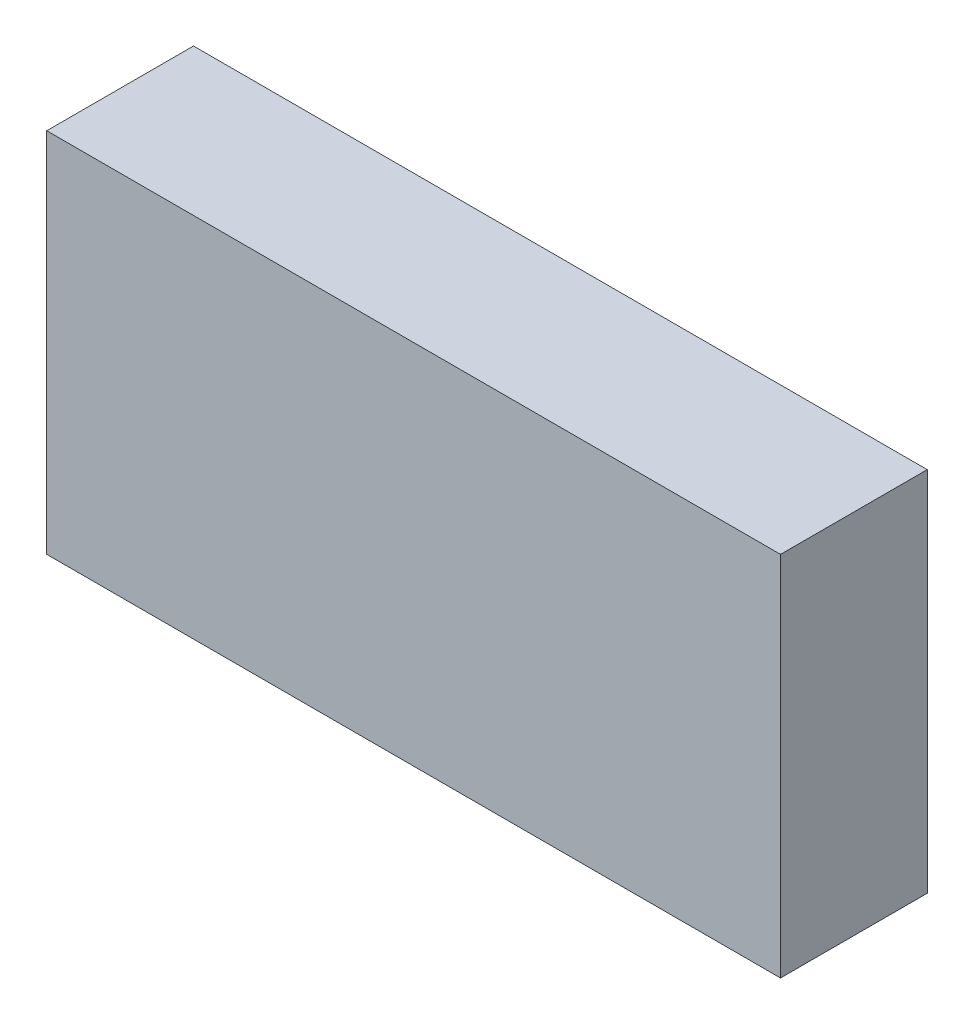
ISO-10303-21;
HEADER;
FILE_DESCRIPTION(('STEP AP214'),'2;1');
FILE_NAME('part.step','',(''),(''),'','','');
FILE_SCHEMA(('AUTOMOTIVE_DESIGN { 1 0 10303 214 1 1 1 1 }'));
ENDSEC;
DATA;
#1=APPLICATION_CONTEXT('core data for automotive mechanical design processes');
#2=APPLICATION_PROTOCOL_DEFINITION('international standard','automotive_design',2000,#1);
#3=PRODUCT_CONTEXT('',#1,'mechanical');
#4=PRODUCT('Part','Part','',(#3));
#5=PRODUCT_RELATED_PRODUCT_CATEGORY('part','',(#4));
#6=PRODUCT_DEFINITION_FORMATION('','',#4);
#7=PRODUCT_DEFINITION_CONTEXT('part definition',#1,'design');
#8=PRODUCT_DEFINITION('design','',#6,#7);
#9=PRODUCT_DEFINITION_SHAPE('','',#8);
#10=(LENGTH_UNIT() NAMED_UNIT(*) SI_UNIT(.MILLI.,.METRE.));
#11=(NAMED_UNIT(*) PLANE_ANGLE_UNIT() SI_UNIT($,.RADIAN.));
#12=(NAMED_UNIT(*) SI_UNIT($,.STERADIAN.) SOLID_ANGLE_UNIT());
#13=UNCERTAINTY_MEASURE_WITH_UNIT(LENGTH_MEASURE(1.E-05),#10,'distance_accuracy_value','');
#14=(GEOMETRIC_REPRESENTATION_CONTEXT(3) GLOBAL_UNCERTAINTY_ASSIGNED_CONTEXT((#13)) GLOBAL_UNIT_ASSIGNED_CONTEXT((#10,
#11,#12)) REPRESENTATION_CONTEXT('',''));
#15=CARTESIAN_POINT('',(0.,0.,0.));
#16=DIRECTION('',(0.,0.,1.));
#17=DIRECTION('',(1.,0.,0.));
#18=AXIS2_PLACEMENT_3D('',#15,#16,#17);
#19=CARTESIAN_POINT('',(3.,55.,20.));
#20=DIRECTION('',(1.,0.,0.));
#21=DIRECTION('',(0.,0.,-1.));
#22=AXIS2_PLACEMENT_3D('',#19,#20,#21);
#23=PLANE('',#22);
#24=DIRECTION('',(0.,-1.,0.));
#25=VECTOR('',#24,1.);
#26=CARTESIAN_POINT('',(3.,55.,0.));
#27=LINE('',#26,#25);
#28=CARTESIAN_POINT('',(3.,55.,0.));
#29=VERTEX_POINT('',#28);
#30=CARTESIAN_POINT('',(3.,5.,0.));
#31=VERTEX_POINT('',#30);
#32=EDGE_CURVE('E148',#29,#31,#27,.T.);
#33=ORIENTED_EDGE('',*,*,#32,.T.);
#34=DIRECTION('',(0.,0.,-1.));
#35=VECTOR('',#34,1.);
#36=CARTESIAN_POINT('',(3.,5.,20.));
#37=LINE('',#36,#35);
#38=CARTESIAN_POINT('',(3.,5.,20.));
#39=VERTEX_POINT('',#38);
#40=EDGE_CURVE('E139',#39,#31,#37,.T.);
#41=ORIENTED_EDGE('',*,*,#40,.F.);
#42=DIRECTION('',(0.,-1.,0.));
#43=VECTOR('',#42,1.);
#44=CARTESIAN_POINT('',(3.,55.,20.));
#45=LINE('',#44,#43);
#46=CARTESIAN_POINT('',(3.,55.,20.));
#47=VERTEX_POINT('',#46);
#48=EDGE_CURVE('E133',#47,#39,#45,.T.);
#49=ORIENTED_EDGE('',*,*,#48,.F.);
#50=DIRECTION('',(0.,0.,-1.));
#51=VECTOR('',#50,1.);
#52=CARTESIAN_POINT('',(3.,55.,20.));
#53=LINE('',#52,#51);
#54=EDGE_CURVE('E144',#47,#29,#53,.T.);
#55=ORIENTED_EDGE('',*,*,#54,.T.);
#56=EDGE_LOOP('',(#33,#41,#49,#55));
#57=FACE_BOUND('',#56,.T.);
#58=ADVANCED_FACE('F42',(#57),#23,.F.);
#59=CARTESIAN_POINT('',(3.,5.,20.));
#60=DIRECTION('',(0.,1.,0.));
#61=DIRECTION('',(0.,0.,1.));
#62=AXIS2_PLACEMENT_3D('',#59,#60,#61);
#63=PLANE('',#62);
#64=DIRECTION('',(1.,0.,0.));
#65=VECTOR('',#64,1.);
#66=CARTESIAN_POINT('',(3.,5.,0.));
#67=LINE('',#66,#65);
#68=CARTESIAN_POINT('',(103.,5.,0.));
#69=VERTEX_POINT('',#68);
#70=EDGE_CURVE('E138',#31,#69,#67,.T.);
#71=ORIENTED_EDGE('',*,*,#70,.T.);
#72=DIRECTION('',(0.,0.,-1.));
#73=VECTOR('',#72,1.);
#74=CARTESIAN_POINT('',(103.,5.,20.));
#75=LINE('',#74,#73);
#76=CARTESIAN_POINT('',(103.,5.,20.));
#77=VERTEX_POINT('',#76);
#78=EDGE_CURVE('E136',#77,#69,#75,.T.);
#79=ORIENTED_EDGE('',*,*,#78,.F.);
#80=DIRECTION('',(1.,0.,0.));
#81=VECTOR('',#80,1.);
#82=CARTESIAN_POINT('',(3.,5.,20.));
#83=LINE('',#82,#81);
#84=EDGE_CURVE('E128',#39,#77,#83,.T.);
#85=ORIENTED_EDGE('',*,*,#84,.F.);
#86=ORIENTED_EDGE('',*,*,#40,.T.);
#87=EDGE_LOOP('',(#71,#79,#85,#86));
#88=FACE_BOUND('',#87,.T.);
#89=ADVANCED_FACE('F137',(#88),#63,.F.);
#90=CARTESIAN_POINT('',(103.,5.,20.));
#91=DIRECTION('',(-1.,0.,0.));
#92=DIRECTION('',(0.,0.,1.));
#93=AXIS2_PLACEMENT_3D('',#90,#91,#92);
#94=PLANE('',#93);
#95=DIRECTION('',(0.,1.,0.));
#96=VECTOR('',#95,1.);
#97=CARTESIAN_POINT('',(103.,5.,0.));
#98=LINE('',#97,#96);
#99=CARTESIAN_POINT('',(103.,55.,0.));
#100=VERTEX_POINT('',#99);
#101=EDGE_CURVE('E114',#69,#100,#98,.T.);
#102=ORIENTED_EDGE('',*,*,#101,.T.);
#103=DIRECTION('',(0.,0.,-1.));
#104=VECTOR('',#103,1.);
#105=CARTESIAN_POINT('',(103.,55.,20.));
#106=LINE('',#105,#104);
#107=CARTESIAN_POINT('',(103.,55.,20.));
#108=VERTEX_POINT('',#107);
#109=EDGE_CURVE('E140',#108,#100,#106,.T.);
#110=ORIENTED_EDGE('',*,*,#109,.F.);
#111=DIRECTION('',(0.,1.,0.));
#112=VECTOR('',#111,1.);
#113=CARTESIAN_POINT('',(103.,5.,20.));
#114=LINE('',#113,#112);
#115=EDGE_CURVE('E131',#77,#108,#114,.T.);
#116=ORIENTED_EDGE('',*,*,#115,.F.);
#117=ORIENTED_EDGE('',*,*,#78,.T.);
#118=EDGE_LOOP('',(#102,#110,#116,#117));
#119=FACE_BOUND('',#118,.T.);
#120=ADVANCED_FACE('F142',(#119),#94,.F.);
#121=CARTESIAN_POINT('',(103.,55.,20.));
#122=DIRECTION('',(0.,-1.,0.));
#123=DIRECTION('',(0.,0.,-1.));
#124=AXIS2_PLACEMENT_3D('',#121,#122,#123);
#125=PLANE('',#124);
#126=DIRECTION('',(-1.,0.,0.));
#127=VECTOR('',#126,1.);
#128=CARTESIAN_POINT('',(103.,55.,0.));
#129=LINE('',#128,#127);
#130=EDGE_CURVE('E120',#100,#29,#129,.T.);
#131=ORIENTED_EDGE('',*,*,#130,.T.);
#132=ORIENTED_EDGE('',*,*,#54,.F.);
#133=DIRECTION('',(-1.,0.,0.));
#134=VECTOR('',#133,1.);
#135=CARTESIAN_POINT('',(103.,55.,20.));
#136=LINE('',#135,#134);
#137=EDGE_CURVE('E97',#108,#47,#136,.T.);
#138=ORIENTED_EDGE('',*,*,#137,.F.);
#139=ORIENTED_EDGE('',*,*,#109,.T.);
#140=EDGE_LOOP('',(#131,#132,#138,#139));
#141=FACE_BOUND('',#140,.T.);
#142=ADVANCED_FACE('F212',(#141),#125,.F.);
#143=CARTESIAN_POINT('',(0.,0.,20.));
#144=DIRECTION('',(0.,0.,1.));
#145=DIRECTION('',(1.,0.,0.));
#146=AXIS2_PLACEMENT_3D('',#143,#144,#145);
#147=PLANE('',#146);
#148=ORIENTED_EDGE('',*,*,#48,.T.);
#149=ORIENTED_EDGE('',*,*,#84,.T.);
#150=ORIENTED_EDGE('',*,*,#115,.T.);
#151=ORIENTED_EDGE('',*,*,#137,.T.);
#152=EDGE_LOOP('',(#148,#149,#150,#151));
#153=FACE_BOUND('',#152,.T.);
#154=ADVANCED_FACE('F129',(#153),#147,.T.);
#155=CARTESIAN_POINT('',(0.,0.,0.));
#156=DIRECTION('',(0.,0.,1.));
#157=DIRECTION('',(1.,0.,0.));
#158=AXIS2_PLACEMENT_3D('',#155,#156,#157);
#159=PLANE('',#158);
#160=ORIENTED_EDGE('',*,*,#32,.F.);
#161=ORIENTED_EDGE('',*,*,#130,.F.);
#162=ORIENTED_EDGE('',*,*,#101,.F.);
#163=ORIENTED_EDGE('',*,*,#70,.F.);
#164=EDGE_LOOP('',(#160,#161,#162,#163));
#165=FACE_BOUND('',#164,.T.);
#166=ADVANCED_FACE('F215',(#165),#159,.F.);
#167=CLOSED_SHELL('',(#58,#89,#120,#142,#154,#166));
#168=CARTESIAN_POINT('',(5.,55.,20.));
#169=DIRECTION('',(1.,0.,0.));
#170=DIRECTION('',(0.,0.,-1.));
#171=AXIS2_PLACEMENT_3D('',#168,#169,#170);
#172=PLANE('',#171);
#173=DIRECTION('',(0.,-1.,0.));
#174=VECTOR('',#173,1.);
#175=CARTESIAN_POINT('',(5.,55.,2.));
#176=LINE('',#175,#174);
#177=CARTESIAN_POINT('',(5.,53.,2.));
#178=VERTEX_POINT('',#177);
#179=CARTESIAN_POINT('',(5.,7.,2.));
#180=VERTEX_POINT('',#179);
#181=EDGE_CURVE('E46',#178,#180,#176,.T.);
#182=ORIENTED_EDGE('',*,*,#181,.F.);
#183=DIRECTION('',(0.,0.,-1.));
#184=VECTOR('',#183,1.);
#185=CARTESIAN_POINT('',(5.,53.,20.));
#186=LINE('',#185,#184);
#187=CARTESIAN_POINT('',(5.,53.,18.));
#188=VERTEX_POINT('',#187);
#189=EDGE_CURVE('E172',#188,#178,#186,.T.);
#190=ORIENTED_EDGE('',*,*,#189,.F.);
#191=DIRECTION('',(0.,-1.,0.));
#192=VECTOR('',#191,1.);
#193=CARTESIAN_POINT('',(5.,55.,18.));
#194=LINE('',#193,#192);
#195=CARTESIAN_POINT('',(5.,7.,18.));
#196=VERTEX_POINT('',#195);
#197=EDGE_CURVE('E159',#188,#196,#194,.T.);
#198=ORIENTED_EDGE('',*,*,#197,.T.);
#199=DIRECTION('',(0.,0.,-1.));
#200=VECTOR('',#199,1.);
#201=CARTESIAN_POINT('',(5.,7.,20.));
#202=LINE('',#201,#200);
#203=EDGE_CURVE('E170',#196,#180,#202,.T.);
#204=ORIENTED_EDGE('',*,*,#203,.T.);
#205=EDGE_LOOP('',(#182,#190,#198,#204));
#206=FACE_BOUND('',#205,.T.);
#207=ADVANCED_FACE('F179',(#206),#172,.T.);
#208=CARTESIAN_POINT('',(3.,7.,20.));
#209=DIRECTION('',(0.,1.,0.));
#210=DIRECTION('',(0.,0.,1.));
#211=AXIS2_PLACEMENT_3D('',#208,#209,#210);
#212=PLANE('',#211);
#213=DIRECTION('',(1.,0.,0.));
#214=VECTOR('',#213,1.);
#215=CARTESIAN_POINT('',(3.,7.,2.));
#216=LINE('',#215,#214);
#217=CARTESIAN_POINT('',(101.,7.,2.));
#218=VERTEX_POINT('',#217);
#219=EDGE_CURVE('E62',#180,#218,#216,.T.);
#220=ORIENTED_EDGE('',*,*,#219,.F.);
#221=ORIENTED_EDGE('',*,*,#203,.F.);
#222=DIRECTION('',(1.,0.,0.));
#223=VECTOR('',#222,1.);
#224=CARTESIAN_POINT('',(3.,7.,18.));
#225=LINE('',#224,#223);
#226=CARTESIAN_POINT('',(101.,7.,18.));
#227=VERTEX_POINT('',#226);
#228=EDGE_CURVE('E85',#196,#227,#225,.T.);
#229=ORIENTED_EDGE('',*,*,#228,.T.);
#230=DIRECTION('',(0.,0.,-1.));
#231=VECTOR('',#230,1.);
#232=CARTESIAN_POINT('',(101.,7.,20.));
#233=LINE('',#232,#231);
#234=EDGE_CURVE('E166',#227,#218,#233,.T.);
#235=ORIENTED_EDGE('',*,*,#234,.T.);
#236=EDGE_LOOP('',(#220,#221,#229,#235));
#237=FACE_BOUND('',#236,.T.);
#238=ADVANCED_FACE('F180',(#237),#212,.T.);
#239=CARTESIAN_POINT('',(101.,5.,20.));
#240=DIRECTION('',(-1.,0.,0.));
#241=DIRECTION('',(0.,0.,1.));
#242=AXIS2_PLACEMENT_3D('',#239,#240,#241);
#243=PLANE('',#242);
#244=DIRECTION('',(0.,1.,0.));
#245=VECTOR('',#244,1.);
#246=CARTESIAN_POINT('',(101.,5.,2.));
#247=LINE('',#246,#245);
#248=CARTESIAN_POINT('',(101.,53.,2.));
#249=VERTEX_POINT('',#248);
#250=EDGE_CURVE('E168',#218,#249,#247,.T.);
#251=ORIENTED_EDGE('',*,*,#250,.F.);
#252=ORIENTED_EDGE('',*,*,#234,.F.);
#253=DIRECTION('',(0.,1.,0.));
#254=VECTOR('',#253,1.);
#255=CARTESIAN_POINT('',(101.,5.,18.));
#256=LINE('',#255,#254);
#257=CARTESIAN_POINT('',(101.,53.,18.));
#258=VERTEX_POINT('',#257);
#259=EDGE_CURVE('E53',#227,#258,#256,.T.);
#260=ORIENTED_EDGE('',*,*,#259,.T.);
#261=DIRECTION('',(0.,0.,-1.));
#262=VECTOR('',#261,1.);
#263=CARTESIAN_POINT('',(101.,53.,20.));
#264=LINE('',#263,#262);
#265=EDGE_CURVE('E161',#258,#249,#264,.T.);
#266=ORIENTED_EDGE('',*,*,#265,.T.);
#267=EDGE_LOOP('',(#251,#252,#260,#266));
#268=FACE_BOUND('',#267,.T.);
#269=ADVANCED_FACE('F184',(#268),#243,.T.);
#270=CARTESIAN_POINT('',(103.,53.,20.));
#271=DIRECTION('',(0.,-1.,0.));
#272=DIRECTION('',(0.,0.,-1.));
#273=AXIS2_PLACEMENT_3D('',#270,#271,#272);
#274=PLANE('',#273);
#275=DIRECTION('',(-1.,0.,0.));
#276=VECTOR('',#275,1.);
#277=CARTESIAN_POINT('',(103.,53.,2.));
#278=LINE('',#277,#276);
#279=EDGE_CURVE('E164',#249,#178,#278,.T.);
#280=ORIENTED_EDGE('',*,*,#279,.F.);
#281=ORIENTED_EDGE('',*,*,#265,.F.);
#282=DIRECTION('',(-1.,0.,0.));
#283=VECTOR('',#282,1.);
#284=CARTESIAN_POINT('',(103.,53.,18.));
#285=LINE('',#284,#283);
#286=EDGE_CURVE('E11',#258,#188,#285,.T.);
#287=ORIENTED_EDGE('',*,*,#286,.T.);
#288=ORIENTED_EDGE('',*,*,#189,.T.);
#289=EDGE_LOOP('',(#280,#281,#287,#288));
#290=FACE_BOUND('',#289,.T.);
#291=ADVANCED_FACE('F188',(#290),#274,.T.);
#292=CARTESIAN_POINT('',(0.,0.,18.));
#293=DIRECTION('',(0.,0.,1.));
#294=DIRECTION('',(1.,0.,0.));
#295=AXIS2_PLACEMENT_3D('',#292,#293,#294);
#296=PLANE('',#295);
#297=ORIENTED_EDGE('',*,*,#197,.F.);
#298=ORIENTED_EDGE('',*,*,#286,.F.);
#299=ORIENTED_EDGE('',*,*,#259,.F.);
#300=ORIENTED_EDGE('',*,*,#228,.F.);
#301=EDGE_LOOP('',(#297,#298,#299,#300));
#302=FACE_BOUND('',#301,.T.);
#303=ADVANCED_FACE('F187',(#302),#296,.F.);
#304=CARTESIAN_POINT('',(0.,0.,2.));
#305=DIRECTION('',(0.,0.,1.));
#306=DIRECTION('',(1.,0.,0.));
#307=AXIS2_PLACEMENT_3D('',#304,#305,#306);
#308=PLANE('',#307);
#309=ORIENTED_EDGE('',*,*,#181,.T.);
#310=ORIENTED_EDGE('',*,*,#219,.T.);
#311=ORIENTED_EDGE('',*,*,#250,.T.);
#312=ORIENTED_EDGE('',*,*,#279,.T.);
#313=EDGE_LOOP('',(#309,#310,#311,#312));
#314=FACE_BOUND('',#313,.T.);
#315=ADVANCED_FACE('F44',(#314),#308,.T.);
#316=CLOSED_SHELL('',(#207,#238,#269,#291,#303,#315));
#317=ORIENTED_CLOSED_SHELL('',*,#316,.T.);
#318=BREP_WITH_VOIDS('B2',#167,(#317));
#319=ADVANCED_BREP_SHAPE_REPRESENTATION('',(#18,#318),#14);
#320=SHAPE_DEFINITION_REPRESENTATION(#9,#319);
ENDSEC;
END-ISO-10303-21;
